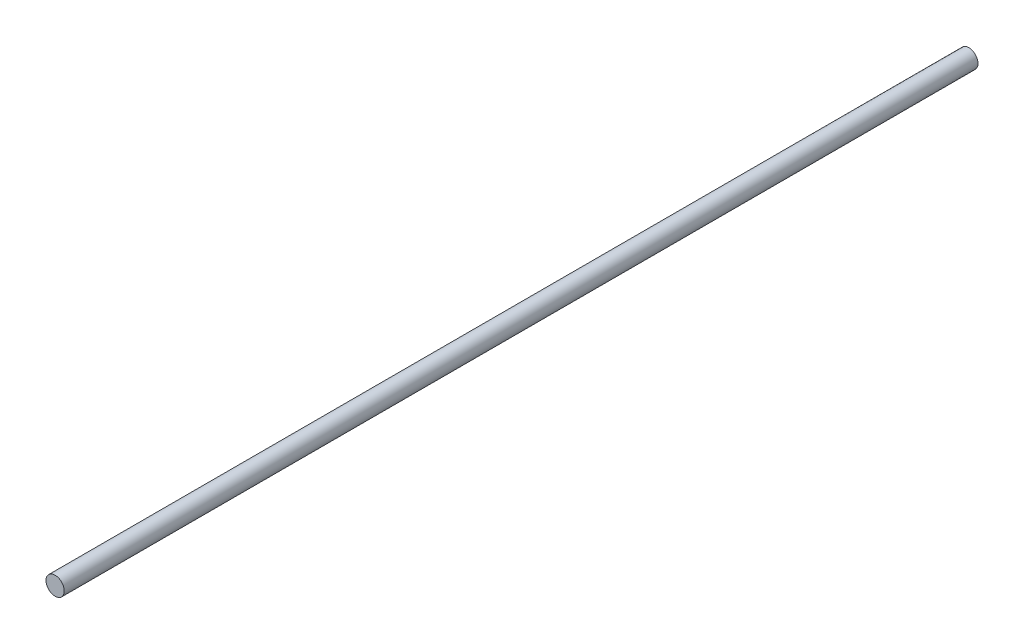
ISO-10303-21;
HEADER;
FILE_DESCRIPTION(('STEP AP214'),'2;1');
FILE_NAME('part.step','',(''),(''),'','','');
FILE_SCHEMA(('AUTOMOTIVE_DESIGN { 1 0 10303 214 1 1 1 1 }'));
ENDSEC;
DATA;
#1=APPLICATION_CONTEXT('core data for automotive mechanical design processes');
#2=APPLICATION_PROTOCOL_DEFINITION('international standard','automotive_design',2000,#1);
#3=PRODUCT_CONTEXT('',#1,'mechanical');
#4=PRODUCT('Part','Part','',(#3));
#5=PRODUCT_RELATED_PRODUCT_CATEGORY('part','',(#4));
#6=PRODUCT_DEFINITION_FORMATION('','',#4);
#7=PRODUCT_DEFINITION_CONTEXT('part definition',#1,'design');
#8=PRODUCT_DEFINITION('design','',#6,#7);
#9=PRODUCT_DEFINITION_SHAPE('','',#8);
#10=(LENGTH_UNIT() NAMED_UNIT(*) SI_UNIT(.MILLI.,.METRE.));
#11=(NAMED_UNIT(*) PLANE_ANGLE_UNIT() SI_UNIT($,.RADIAN.));
#12=(NAMED_UNIT(*) SI_UNIT($,.STERADIAN.) SOLID_ANGLE_UNIT());
#13=UNCERTAINTY_MEASURE_WITH_UNIT(LENGTH_MEASURE(1.E-05),#10,'distance_accuracy_value','');
#14=(GEOMETRIC_REPRESENTATION_CONTEXT(3) GLOBAL_UNCERTAINTY_ASSIGNED_CONTEXT((#13)) GLOBAL_UNIT_ASSIGNED_CONTEXT((#10,
#11,#12)) REPRESENTATION_CONTEXT('',''));
#15=CARTESIAN_POINT('',(0.,0.,0.));
#16=DIRECTION('',(0.,0.,1.));
#17=DIRECTION('',(1.,0.,0.));
#18=AXIS2_PLACEMENT_3D('',#15,#16,#17);
#19=CARTESIAN_POINT('',(0.,0.,100.));
#20=DIRECTION('',(0.,0.,-1.));
#21=DIRECTION('',(-1.,0.,0.));
#22=AXIS2_PLACEMENT_3D('',#19,#20,#21);
#23=CYLINDRICAL_SURFACE('',#22,1.);
#24=CARTESIAN_POINT('',(0.,0.,100.));
#25=DIRECTION('',(0.,0.,1.));
#26=DIRECTION('',(1.,0.,0.));
#27=AXIS2_PLACEMENT_3D('',#24,#25,#26);
#28=CIRCLE('',#27,1.);
#29=CARTESIAN_POINT('',(1.,0.,100.));
#30=VERTEX_POINT('',#29);
#31=EDGE_CURVE('E10',#30,#30,#28,.T.);
#32=ORIENTED_EDGE('',*,*,#31,.F.);
#33=EDGE_LOOP('',(#32));
#34=FACE_BOUND('',#33,.T.);
#35=CARTESIAN_POINT('',(0.,0.,0.));
#36=DIRECTION('',(0.,0.,1.));
#37=DIRECTION('',(1.,0.,0.));
#38=AXIS2_PLACEMENT_3D('',#35,#36,#37);
#39=CIRCLE('',#38,1.);
#40=CARTESIAN_POINT('',(1.,0.,0.));
#41=VERTEX_POINT('',#40);
#42=EDGE_CURVE('E39',#41,#41,#39,.T.);
#43=ORIENTED_EDGE('',*,*,#42,.T.);
#44=EDGE_LOOP('',(#43));
#45=FACE_BOUND('',#44,.T.);
#46=ADVANCED_FACE('F36',(#34,#45),#23,.T.);
#47=CARTESIAN_POINT('',(0.,0.,100.));
#48=DIRECTION('',(0.,0.,1.));
#49=DIRECTION('',(1.,0.,0.));
#50=AXIS2_PLACEMENT_3D('',#47,#48,#49);
#51=PLANE('',#50);
#52=ORIENTED_EDGE('',*,*,#31,.T.);
#53=EDGE_LOOP('',(#52));
#54=FACE_BOUND('',#53,.T.);
#55=ADVANCED_FACE('F51',(#54),#51,.T.);
#56=CARTESIAN_POINT('',(0.,0.,0.));
#57=DIRECTION('',(0.,0.,1.));
#58=DIRECTION('',(1.,0.,0.));
#59=AXIS2_PLACEMENT_3D('',#56,#57,#58);
#60=PLANE('',#59);
#61=ORIENTED_EDGE('',*,*,#42,.F.);
#62=EDGE_LOOP('',(#61));
#63=FACE_BOUND('',#62,.T.);
#64=ADVANCED_FACE('F49',(#63),#60,.F.);
#65=CLOSED_SHELL('',(#46,#55,#64));
#66=MANIFOLD_SOLID_BREP('B2',#65);
#67=ADVANCED_BREP_SHAPE_REPRESENTATION('',(#18,#66),#14);
#68=SHAPE_DEFINITION_REPRESENTATION(#9,#67);
ENDSEC;
END-ISO-10303-21;
